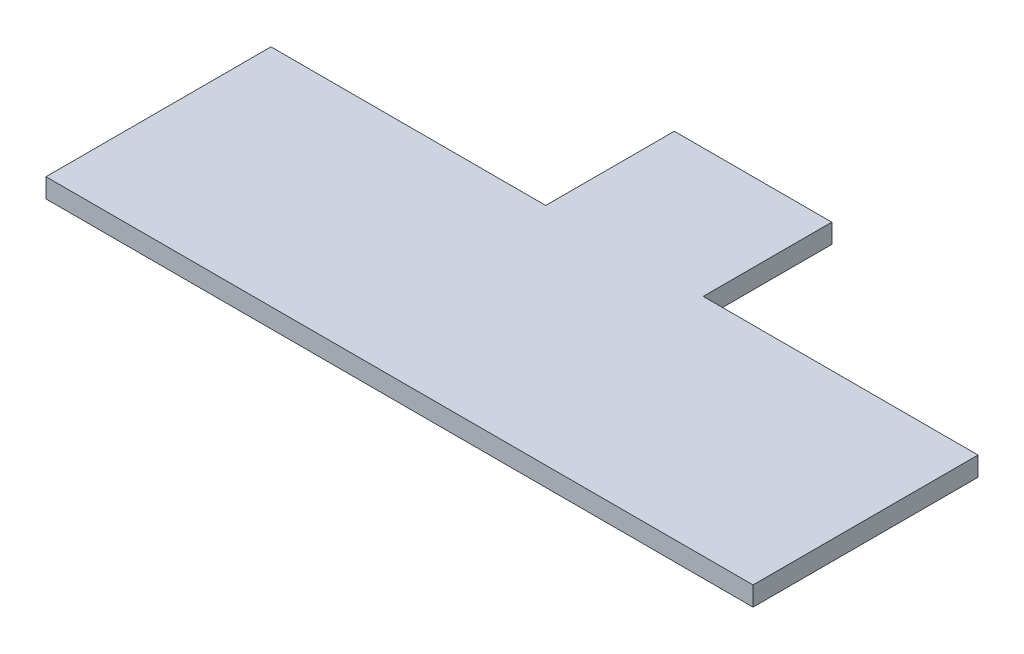
ISO-10303-21;
HEADER;
FILE_DESCRIPTION(('STEP AP214'),'2;1');
FILE_NAME('part.step','',(''),(''),'','','');
FILE_SCHEMA(('AUTOMOTIVE_DESIGN { 1 0 10303 214 1 1 1 1 }'));
ENDSEC;
DATA;
#1=APPLICATION_CONTEXT('core data for automotive mechanical design processes');
#2=APPLICATION_PROTOCOL_DEFINITION('international standard','automotive_design',2000,#1);
#3=PRODUCT_CONTEXT('',#1,'mechanical');
#4=PRODUCT('Part','Part','',(#3));
#5=PRODUCT_RELATED_PRODUCT_CATEGORY('part','',(#4));
#6=PRODUCT_DEFINITION_FORMATION('','',#4);
#7=PRODUCT_DEFINITION_CONTEXT('part definition',#1,'design');
#8=PRODUCT_DEFINITION('design','',#6,#7);
#9=PRODUCT_DEFINITION_SHAPE('','',#8);
#10=(LENGTH_UNIT() NAMED_UNIT(*) SI_UNIT(.MILLI.,.METRE.));
#11=(NAMED_UNIT(*) PLANE_ANGLE_UNIT() SI_UNIT($,.RADIAN.));
#12=(NAMED_UNIT(*) SI_UNIT($,.STERADIAN.) SOLID_ANGLE_UNIT());
#13=UNCERTAINTY_MEASURE_WITH_UNIT(LENGTH_MEASURE(1.E-05),#10,'distance_accuracy_value','');
#14=(GEOMETRIC_REPRESENTATION_CONTEXT(3) GLOBAL_UNCERTAINTY_ASSIGNED_CONTEXT((#13)) GLOBAL_UNIT_ASSIGNED_CONTEXT((#10,
#11,#12)) REPRESENTATION_CONTEXT('',''));
#15=CARTESIAN_POINT('',(0.,0.,0.));
#16=DIRECTION('',(0.,0.,1.));
#17=DIRECTION('',(1.,0.,0.));
#18=AXIS2_PLACEMENT_3D('',#15,#16,#17);
#19=CARTESIAN_POINT('',(-348.405099866875,6.,-66.0577311852511));
#20=DIRECTION('',(1.,0.,0.));
#21=DIRECTION('',(0.,0.,-1.));
#22=AXIS2_PLACEMENT_3D('',#19,#20,#21);
#23=PLANE('',#22);
#24=DIRECTION('',(0.,0.,1.));
#25=VECTOR('',#24,1.);
#26=CARTESIAN_POINT('',(-348.405099866875,0.,-66.0577311852511));
#27=LINE('',#26,#25);
#28=CARTESIAN_POINT('',(-348.405099866875,0.,-66.0577311852511));
#29=VERTEX_POINT('',#28);
#30=CARTESIAN_POINT('',(-348.405099866875,0.,3.94226881474893));
#31=VERTEX_POINT('',#30);
#32=EDGE_CURVE('E129',#29,#31,#27,.T.);
#33=ORIENTED_EDGE('',*,*,#32,.T.);
#34=DIRECTION('',(0.,-1.,0.));
#35=VECTOR('',#34,1.);
#36=CARTESIAN_POINT('',(-348.405099866875,6.,3.94226881474893));
#37=LINE('',#36,#35);
#38=CARTESIAN_POINT('',(-348.405099866875,6.,3.94226881474893));
#39=VERTEX_POINT('',#38);
#40=EDGE_CURVE('E11',#39,#31,#37,.T.);
#41=ORIENTED_EDGE('',*,*,#40,.F.);
#42=DIRECTION('',(0.,0.,1.));
#43=VECTOR('',#42,1.);
#44=CARTESIAN_POINT('',(-348.405099866875,6.,-66.0577311852511));
#45=LINE('',#44,#43);
#46=CARTESIAN_POINT('',(-348.405099866875,6.,-66.0577311852511));
#47=VERTEX_POINT('',#46);
#48=EDGE_CURVE('E143',#47,#39,#45,.T.);
#49=ORIENTED_EDGE('',*,*,#48,.F.);
#50=DIRECTION('',(0.,-1.,0.));
#51=VECTOR('',#50,1.);
#52=CARTESIAN_POINT('',(-348.405099866875,6.,-66.0577311852511));
#53=LINE('',#52,#51);
#54=EDGE_CURVE('E125',#47,#29,#53,.T.);
#55=ORIENTED_EDGE('',*,*,#54,.T.);
#56=EDGE_LOOP('',(#33,#41,#49,#55));
#57=FACE_BOUND('',#56,.T.);
#58=ADVANCED_FACE('F33',(#57),#23,.F.);
#59=CARTESIAN_POINT('',(-348.405099866875,6.,3.94226881474893));
#60=DIRECTION('',(0.,0.,-1.));
#61=DIRECTION('',(-1.,0.,0.));
#62=AXIS2_PLACEMENT_3D('',#59,#60,#61);
#63=PLANE('',#62);
#64=DIRECTION('',(1.,0.,0.));
#65=VECTOR('',#64,1.);
#66=CARTESIAN_POINT('',(-348.405099866875,0.,3.94226881474893));
#67=LINE('',#66,#65);
#68=CARTESIAN_POINT('',(-128.405099866875,0.,3.94226881474891));
#69=VERTEX_POINT('',#68);
#70=EDGE_CURVE('E132',#31,#69,#67,.T.);
#71=ORIENTED_EDGE('',*,*,#70,.T.);
#72=DIRECTION('',(0.,-1.,0.));
#73=VECTOR('',#72,1.);
#74=CARTESIAN_POINT('',(-128.405099866875,6.,3.94226881474891));
#75=LINE('',#74,#73);
#76=CARTESIAN_POINT('',(-128.405099866875,6.,3.94226881474891));
#77=VERTEX_POINT('',#76);
#78=EDGE_CURVE('E41',#77,#69,#75,.T.);
#79=ORIENTED_EDGE('',*,*,#78,.F.);
#80=DIRECTION('',(1.,0.,0.));
#81=VECTOR('',#80,1.);
#82=CARTESIAN_POINT('',(-348.405099866875,6.,3.94226881474893));
#83=LINE('',#82,#81);
#84=EDGE_CURVE('E92',#39,#77,#83,.T.);
#85=ORIENTED_EDGE('',*,*,#84,.F.);
#86=ORIENTED_EDGE('',*,*,#40,.T.);
#87=EDGE_LOOP('',(#71,#79,#85,#86));
#88=FACE_BOUND('',#87,.T.);
#89=ADVANCED_FACE('F178',(#88),#63,.F.);
#90=CARTESIAN_POINT('',(-128.405099866875,6.,-66.0577311852511));
#91=DIRECTION('',(-1.,0.,0.));
#92=DIRECTION('',(0.,0.,1.));
#93=AXIS2_PLACEMENT_3D('',#90,#91,#92);
#94=PLANE('',#93);
#95=DIRECTION('',(0.,0.,-1.));
#96=VECTOR('',#95,1.);
#97=CARTESIAN_POINT('',(-128.405099866875,0.,-66.0577311852511));
#98=LINE('',#97,#96);
#99=CARTESIAN_POINT('',(-128.405099866875,0.,-66.0577311852511));
#100=VERTEX_POINT('',#99);
#101=EDGE_CURVE('E134',#69,#100,#98,.T.);
#102=ORIENTED_EDGE('',*,*,#101,.T.);
#103=DIRECTION('',(0.,-1.,0.));
#104=VECTOR('',#103,1.);
#105=CARTESIAN_POINT('',(-128.405099866875,6.,-66.0577311852511));
#106=LINE('',#105,#104);
#107=CARTESIAN_POINT('',(-128.405099866875,6.,-66.0577311852511));
#108=VERTEX_POINT('',#107);
#109=EDGE_CURVE('E150',#108,#100,#106,.T.);
#110=ORIENTED_EDGE('',*,*,#109,.F.);
#111=DIRECTION('',(0.,0.,-1.));
#112=VECTOR('',#111,1.);
#113=CARTESIAN_POINT('',(-128.405099866875,6.,-66.0577311852511));
#114=LINE('',#113,#112);
#115=EDGE_CURVE('E158',#77,#108,#114,.T.);
#116=ORIENTED_EDGE('',*,*,#115,.F.);
#117=ORIENTED_EDGE('',*,*,#78,.T.);
#118=EDGE_LOOP('',(#102,#110,#116,#117));
#119=FACE_BOUND('',#118,.T.);
#120=ADVANCED_FACE('F156',(#119),#94,.F.);
#121=CARTESIAN_POINT('',(-213.905099866875,6.,-66.0577311852511));
#122=DIRECTION('',(0.,0.,1.));
#123=DIRECTION('',(1.,0.,0.));
#124=AXIS2_PLACEMENT_3D('',#121,#122,#123);
#125=PLANE('',#124);
#126=DIRECTION('',(-1.,0.,0.));
#127=VECTOR('',#126,1.);
#128=CARTESIAN_POINT('',(-213.905099866875,0.,-66.0577311852511));
#129=LINE('',#128,#127);
#130=CARTESIAN_POINT('',(-213.905099866875,0.,-66.0577311852511));
#131=VERTEX_POINT('',#130);
#132=EDGE_CURVE('E136',#100,#131,#129,.T.);
#133=ORIENTED_EDGE('',*,*,#132,.T.);
#134=DIRECTION('',(0.,-1.,0.));
#135=VECTOR('',#134,1.);
#136=CARTESIAN_POINT('',(-213.905099866875,6.,-66.0577311852511));
#137=LINE('',#136,#135);
#138=CARTESIAN_POINT('',(-213.905099866875,6.,-66.0577311852511));
#139=VERTEX_POINT('',#138);
#140=EDGE_CURVE('E147',#139,#131,#137,.T.);
#141=ORIENTED_EDGE('',*,*,#140,.F.);
#142=DIRECTION('',(-1.,0.,0.));
#143=VECTOR('',#142,1.);
#144=CARTESIAN_POINT('',(-213.905099866875,6.,-66.0577311852511));
#145=LINE('',#144,#143);
#146=EDGE_CURVE('E170',#108,#139,#145,.T.);
#147=ORIENTED_EDGE('',*,*,#146,.F.);
#148=ORIENTED_EDGE('',*,*,#109,.T.);
#149=EDGE_LOOP('',(#133,#141,#147,#148));
#150=FACE_BOUND('',#149,.T.);
#151=ADVANCED_FACE('F166',(#150),#125,.F.);
#152=CARTESIAN_POINT('',(-213.905099866875,6.,-106.057731185251));
#153=DIRECTION('',(-1.,0.,0.));
#154=DIRECTION('',(0.,0.,1.));
#155=AXIS2_PLACEMENT_3D('',#152,#153,#154);
#156=PLANE('',#155);
#157=DIRECTION('',(0.,0.,-1.));
#158=VECTOR('',#157,1.);
#159=CARTESIAN_POINT('',(-213.905099866875,0.,-106.057731185251));
#160=LINE('',#159,#158);
#161=CARTESIAN_POINT('',(-213.905099866875,0.,-106.057731185251));
#162=VERTEX_POINT('',#161);
#163=EDGE_CURVE('E138',#131,#162,#160,.T.);
#164=ORIENTED_EDGE('',*,*,#163,.T.);
#165=DIRECTION('',(0.,-1.,0.));
#166=VECTOR('',#165,1.);
#167=CARTESIAN_POINT('',(-213.905099866875,6.,-106.057731185251));
#168=LINE('',#167,#166);
#169=CARTESIAN_POINT('',(-213.905099866875,6.,-106.057731185251));
#170=VERTEX_POINT('',#169);
#171=EDGE_CURVE('E120',#170,#162,#168,.T.);
#172=ORIENTED_EDGE('',*,*,#171,.F.);
#173=DIRECTION('',(0.,0.,-1.));
#174=VECTOR('',#173,1.);
#175=CARTESIAN_POINT('',(-213.905099866875,6.,-106.057731185251));
#176=LINE('',#175,#174);
#177=EDGE_CURVE('E111',#139,#170,#176,.T.);
#178=ORIENTED_EDGE('',*,*,#177,.F.);
#179=ORIENTED_EDGE('',*,*,#140,.T.);
#180=EDGE_LOOP('',(#164,#172,#178,#179));
#181=FACE_BOUND('',#180,.T.);
#182=ADVANCED_FACE('F169',(#181),#156,.F.);
#183=CARTESIAN_POINT('',(-262.905099866875,6.,-106.057731185251));
#184=DIRECTION('',(0.,0.,1.));
#185=DIRECTION('',(1.,0.,0.));
#186=AXIS2_PLACEMENT_3D('',#183,#184,#185);
#187=PLANE('',#186);
#188=DIRECTION('',(-1.,0.,0.));
#189=VECTOR('',#188,1.);
#190=CARTESIAN_POINT('',(-262.905099866875,0.,-106.057731185251));
#191=LINE('',#190,#189);
#192=CARTESIAN_POINT('',(-262.905099866875,0.,-106.057731185251));
#193=VERTEX_POINT('',#192);
#194=EDGE_CURVE('E119',#162,#193,#191,.T.);
#195=ORIENTED_EDGE('',*,*,#194,.T.);
#196=DIRECTION('',(0.,-1.,0.));
#197=VECTOR('',#196,1.);
#198=CARTESIAN_POINT('',(-262.905099866875,6.,-106.057731185251));
#199=LINE('',#198,#197);
#200=CARTESIAN_POINT('',(-262.905099866875,6.,-106.057731185251));
#201=VERTEX_POINT('',#200);
#202=EDGE_CURVE('E116',#201,#193,#199,.T.);
#203=ORIENTED_EDGE('',*,*,#202,.F.);
#204=DIRECTION('',(-1.,0.,0.));
#205=VECTOR('',#204,1.);
#206=CARTESIAN_POINT('',(-262.905099866875,6.,-106.057731185251));
#207=LINE('',#206,#205);
#208=EDGE_CURVE('E105',#170,#201,#207,.T.);
#209=ORIENTED_EDGE('',*,*,#208,.F.);
#210=ORIENTED_EDGE('',*,*,#171,.T.);
#211=EDGE_LOOP('',(#195,#203,#209,#210));
#212=FACE_BOUND('',#211,.T.);
#213=ADVANCED_FACE('F117',(#212),#187,.F.);
#214=CARTESIAN_POINT('',(-262.905099866875,6.,-66.0577311852511));
#215=DIRECTION('',(1.,0.,0.));
#216=DIRECTION('',(0.,0.,-1.));
#217=AXIS2_PLACEMENT_3D('',#214,#215,#216);
#218=PLANE('',#217);
#219=DIRECTION('',(0.,0.,1.));
#220=VECTOR('',#219,1.);
#221=CARTESIAN_POINT('',(-262.905099866875,0.,-66.0577311852511));
#222=LINE('',#221,#220);
#223=CARTESIAN_POINT('',(-262.905099866875,0.,-66.0577311852511));
#224=VERTEX_POINT('',#223);
#225=EDGE_CURVE('E78',#193,#224,#222,.T.);
#226=ORIENTED_EDGE('',*,*,#225,.T.);
#227=DIRECTION('',(0.,-1.,0.));
#228=VECTOR('',#227,1.);
#229=CARTESIAN_POINT('',(-262.905099866875,6.,-66.0577311852511));
#230=LINE('',#229,#228);
#231=CARTESIAN_POINT('',(-262.905099866875,6.,-66.0577311852511));
#232=VERTEX_POINT('',#231);
#233=EDGE_CURVE('E121',#232,#224,#230,.T.);
#234=ORIENTED_EDGE('',*,*,#233,.F.);
#235=DIRECTION('',(0.,0.,1.));
#236=VECTOR('',#235,1.);
#237=CARTESIAN_POINT('',(-262.905099866875,6.,-66.0577311852511));
#238=LINE('',#237,#236);
#239=EDGE_CURVE('E109',#201,#232,#238,.T.);
#240=ORIENTED_EDGE('',*,*,#239,.F.);
#241=ORIENTED_EDGE('',*,*,#202,.T.);
#242=EDGE_LOOP('',(#226,#234,#240,#241));
#243=FACE_BOUND('',#242,.T.);
#244=ADVANCED_FACE('F123',(#243),#218,.F.);
#245=CARTESIAN_POINT('',(-348.405099866875,6.,-66.0577311852511));
#246=DIRECTION('',(0.,0.,1.));
#247=DIRECTION('',(1.,0.,0.));
#248=AXIS2_PLACEMENT_3D('',#245,#246,#247);
#249=PLANE('',#248);
#250=DIRECTION('',(-1.,0.,0.));
#251=VECTOR('',#250,1.);
#252=CARTESIAN_POINT('',(-348.405099866875,0.,-66.0577311852511));
#253=LINE('',#252,#251);
#254=EDGE_CURVE('E84',#224,#29,#253,.T.);
#255=ORIENTED_EDGE('',*,*,#254,.T.);
#256=ORIENTED_EDGE('',*,*,#54,.F.);
#257=DIRECTION('',(-1.,0.,0.));
#258=VECTOR('',#257,1.);
#259=CARTESIAN_POINT('',(-348.405099866875,6.,-66.0577311852511));
#260=LINE('',#259,#258);
#261=EDGE_CURVE('E49',#232,#47,#260,.T.);
#262=ORIENTED_EDGE('',*,*,#261,.F.);
#263=ORIENTED_EDGE('',*,*,#233,.T.);
#264=EDGE_LOOP('',(#255,#256,#262,#263));
#265=FACE_BOUND('',#264,.T.);
#266=ADVANCED_FACE('F194',(#265),#249,.F.);
#267=CARTESIAN_POINT('',(0.,6.,0.));
#268=DIRECTION('',(0.,1.,0.));
#269=DIRECTION('',(0.,0.,1.));
#270=AXIS2_PLACEMENT_3D('',#267,#268,#269);
#271=PLANE('',#270);
#272=ORIENTED_EDGE('',*,*,#48,.T.);
#273=ORIENTED_EDGE('',*,*,#84,.T.);
#274=ORIENTED_EDGE('',*,*,#115,.T.);
#275=ORIENTED_EDGE('',*,*,#146,.T.);
#276=ORIENTED_EDGE('',*,*,#177,.T.);
#277=ORIENTED_EDGE('',*,*,#208,.T.);
#278=ORIENTED_EDGE('',*,*,#239,.T.);
#279=ORIENTED_EDGE('',*,*,#261,.T.);
#280=EDGE_LOOP('',(#272,#273,#274,#275,#276,#277,#278,#279));
#281=FACE_BOUND('',#280,.T.);
#282=ADVANCED_FACE('F107',(#281),#271,.T.);
#283=CARTESIAN_POINT('',(0.,0.,0.));
#284=DIRECTION('',(0.,1.,0.));
#285=DIRECTION('',(0.,0.,1.));
#286=AXIS2_PLACEMENT_3D('',#283,#284,#285);
#287=PLANE('',#286);
#288=ORIENTED_EDGE('',*,*,#32,.F.);
#289=ORIENTED_EDGE('',*,*,#254,.F.);
#290=ORIENTED_EDGE('',*,*,#225,.F.);
#291=ORIENTED_EDGE('',*,*,#194,.F.);
#292=ORIENTED_EDGE('',*,*,#163,.F.);
#293=ORIENTED_EDGE('',*,*,#132,.F.);
#294=ORIENTED_EDGE('',*,*,#101,.F.);
#295=ORIENTED_EDGE('',*,*,#70,.F.);
#296=EDGE_LOOP('',(#288,#289,#290,#291,#292,#293,#294,#295));
#297=FACE_BOUND('',#296,.T.);
#298=ADVANCED_FACE('F162',(#297),#287,.F.);
#299=CLOSED_SHELL('',(#58,#89,#120,#151,#182,#213,#244,#266,#282,#298));
#300=MANIFOLD_SOLID_BREP('B2',#299);
#301=ADVANCED_BREP_SHAPE_REPRESENTATION('',(#18,#300),#14);
#302=SHAPE_DEFINITION_REPRESENTATION(#9,#301);
ENDSEC;
END-ISO-10303-21;
